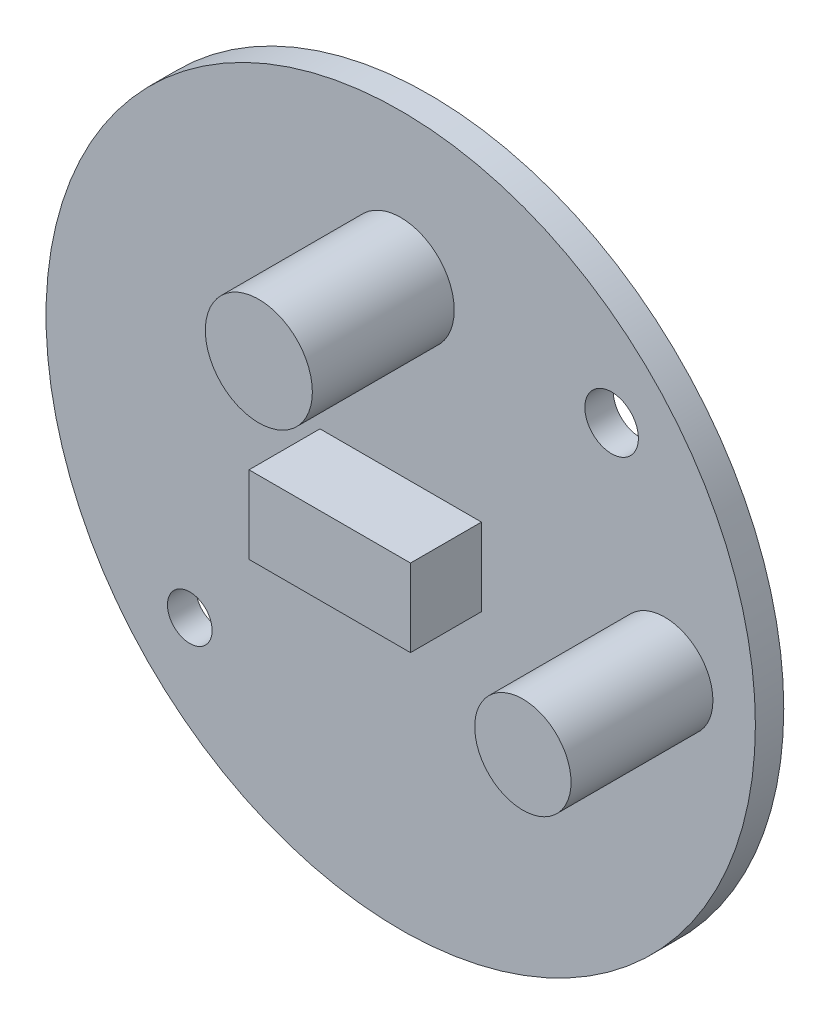
ISO-10303-21;
HEADER;
FILE_DESCRIPTION(('STEP AP214'),'2;1');
FILE_NAME('part.step','',(''),(''),'','','');
FILE_SCHEMA(('AUTOMOTIVE_DESIGN { 1 0 10303 214 1 1 1 1 }'));
ENDSEC;
DATA;
#1=APPLICATION_CONTEXT('core data for automotive mechanical design processes');
#2=APPLICATION_PROTOCOL_DEFINITION('international standard','automotive_design',2000,#1);
#3=PRODUCT_CONTEXT('',#1,'mechanical');
#4=PRODUCT('Part','Part','',(#3));
#5=PRODUCT_RELATED_PRODUCT_CATEGORY('part','',(#4));
#6=PRODUCT_DEFINITION_FORMATION('','',#4);
#7=PRODUCT_DEFINITION_CONTEXT('part definition',#1,'design');
#8=PRODUCT_DEFINITION('design','',#6,#7);
#9=PRODUCT_DEFINITION_SHAPE('','',#8);
#10=(LENGTH_UNIT() NAMED_UNIT(*) SI_UNIT(.MILLI.,.METRE.));
#11=(NAMED_UNIT(*) PLANE_ANGLE_UNIT() SI_UNIT($,.RADIAN.));
#12=(NAMED_UNIT(*) SI_UNIT($,.STERADIAN.) SOLID_ANGLE_UNIT());
#13=UNCERTAINTY_MEASURE_WITH_UNIT(LENGTH_MEASURE(1.E-05),#10,'distance_accuracy_value','');
#14=(GEOMETRIC_REPRESENTATION_CONTEXT(3) GLOBAL_UNCERTAINTY_ASSIGNED_CONTEXT((#13)) GLOBAL_UNIT_ASSIGNED_CONTEXT((#10,
#11,#12)) REPRESENTATION_CONTEXT('',''));
#15=CARTESIAN_POINT('',(0.,0.,0.));
#16=DIRECTION('',(0.,0.,1.));
#17=DIRECTION('',(1.,0.,0.));
#18=AXIS2_PLACEMENT_3D('',#15,#16,#17);
#19=CARTESIAN_POINT('',(0.,0.,2.));
#20=DIRECTION('',(0.,0.,1.));
#21=DIRECTION('',(1.,0.,0.));
#22=AXIS2_PLACEMENT_3D('',#19,#20,#21);
#23=PLANE('',#22);
#24=CARTESIAN_POINT('',(-14.8658829249433,-13.379294632449,2.));
#25=DIRECTION('',(0.,0.,1.));
#26=DIRECTION('',(1.,0.,0.));
#27=AXIS2_PLACEMENT_3D('',#24,#25,#26);
#28=CIRCLE('',#27,1.57488491081214);
#29=CARTESIAN_POINT('',(-13.2909980141312,-13.379294632449,2.));
#30=VERTEX_POINT('',#29);
#31=EDGE_CURVE('E151',#30,#30,#28,.T.);
#32=ORIENTED_EDGE('',*,*,#31,.F.);
#33=EDGE_LOOP('',(#32));
#34=FACE_BOUND('',#33,.T.);
#35=CARTESIAN_POINT('',(14.8658829249433,13.379294632449,2.));
#36=DIRECTION('',(0.,0.,1.));
#37=DIRECTION('',(1.,0.,0.));
#38=AXIS2_PLACEMENT_3D('',#35,#36,#37);
#39=CIRCLE('',#38,1.88796675128296);
#40=CARTESIAN_POINT('',(16.7538496762263,13.379294632449,2.));
#41=VERTEX_POINT('',#40);
#42=EDGE_CURVE('E158',#41,#41,#39,.T.);
#43=ORIENTED_EDGE('',*,*,#42,.F.);
#44=EDGE_LOOP('',(#43));
#45=FACE_BOUND('',#44,.T.);
#46=CARTESIAN_POINT('',(18.6111465208631,0.,2.));
#47=DIRECTION('',(0.,0.,1.));
#48=DIRECTION('',(1.,0.,0.));
#49=AXIS2_PLACEMENT_3D('',#46,#47,#48);
#50=CIRCLE('',#49,3.39523039396583);
#51=CARTESIAN_POINT('',(22.0063769148289,0.,2.));
#52=VERTEX_POINT('',#51);
#53=EDGE_CURVE('E130',#52,#52,#50,.T.);
#54=ORIENTED_EDGE('',*,*,#53,.F.);
#55=EDGE_LOOP('',(#54));
#56=FACE_BOUND('',#55,.T.);
#57=CARTESIAN_POINT('',(0.,14.7126650405187,2.));
#58=DIRECTION('',(0.,0.,1.));
#59=DIRECTION('',(1.,0.,0.));
#60=AXIS2_PLACEMENT_3D('',#57,#58,#59);
#61=CIRCLE('',#60,3.7724782155176);
#62=CARTESIAN_POINT('',(3.7724782155176,14.7126650405187,2.));
#63=VERTEX_POINT('',#62);
#64=EDGE_CURVE('E135',#63,#63,#61,.T.);
#65=ORIENTED_EDGE('',*,*,#64,.F.);
#66=EDGE_LOOP('',(#65));
#67=FACE_BOUND('',#66,.T.);
#68=CARTESIAN_POINT('',(0.,0.,2.));
#69=DIRECTION('',(0.,0.,1.));
#70=DIRECTION('',(1.,0.,0.));
#71=AXIS2_PLACEMENT_3D('',#68,#69,#70);
#72=CIRCLE('',#71,25.);
#73=CARTESIAN_POINT('',(25.,0.,2.));
#74=VERTEX_POINT('',#73);
#75=EDGE_CURVE('E11',#74,#74,#72,.T.);
#76=ORIENTED_EDGE('',*,*,#75,.T.);
#77=EDGE_LOOP('',(#76));
#78=FACE_BOUND('',#77,.T.);
#79=DIRECTION('',(-1.,0.,0.));
#80=VECTOR('',#79,1.);
#81=CARTESIAN_POINT('',(-5.69040863271529,2.73504670625025,2.));
#82=LINE('',#81,#80);
#83=CARTESIAN_POINT('',(5.69040863271529,2.73504670625025,2.));
#84=VERTEX_POINT('',#83);
#85=CARTESIAN_POINT('',(-5.69040863271529,2.73504670625025,2.));
#86=VERTEX_POINT('',#85);
#87=EDGE_CURVE('E99',#84,#86,#82,.T.);
#88=ORIENTED_EDGE('',*,*,#87,.F.);
#89=DIRECTION('',(0.,1.,0.));
#90=VECTOR('',#89,1.);
#91=CARTESIAN_POINT('',(5.69040863271529,2.73504670625025,2.));
#92=LINE('',#91,#90);
#93=CARTESIAN_POINT('',(5.69040863271529,-2.73504670625025,2.));
#94=VERTEX_POINT('',#93);
#95=EDGE_CURVE('E113',#94,#84,#92,.T.);
#96=ORIENTED_EDGE('',*,*,#95,.F.);
#97=DIRECTION('',(1.,0.,0.));
#98=VECTOR('',#97,1.);
#99=CARTESIAN_POINT('',(-5.69040863271529,-2.73504670625025,2.));
#100=LINE('',#99,#98);
#101=CARTESIAN_POINT('',(-5.69040863271529,-2.73504670625025,2.));
#102=VERTEX_POINT('',#101);
#103=EDGE_CURVE('E79',#102,#94,#100,.T.);
#104=ORIENTED_EDGE('',*,*,#103,.F.);
#105=DIRECTION('',(0.,-1.,0.));
#106=VECTOR('',#105,1.);
#107=CARTESIAN_POINT('',(-5.69040863271529,2.73504670625025,2.));
#108=LINE('',#107,#106);
#109=EDGE_CURVE('E119',#86,#102,#108,.T.);
#110=ORIENTED_EDGE('',*,*,#109,.F.);
#111=EDGE_LOOP('',(#88,#96,#104,#110));
#112=FACE_BOUND('',#111,.T.);
#113=ADVANCED_FACE('F39',(#34,#45,#56,#67,#78,#112),#23,.T.);
#114=CARTESIAN_POINT('',(0.,0.,2.));
#115=DIRECTION('',(0.,0.,-1.));
#116=DIRECTION('',(-1.,0.,0.));
#117=AXIS2_PLACEMENT_3D('',#114,#115,#116);
#118=CYLINDRICAL_SURFACE('',#117,25.);
#119=ORIENTED_EDGE('',*,*,#75,.F.);
#120=EDGE_LOOP('',(#119));
#121=FACE_BOUND('',#120,.T.);
#122=CARTESIAN_POINT('',(0.,0.,0.));
#123=DIRECTION('',(0.,0.,1.));
#124=DIRECTION('',(1.,0.,0.));
#125=AXIS2_PLACEMENT_3D('',#122,#123,#124);
#126=CIRCLE('',#125,25.);
#127=CARTESIAN_POINT('',(25.,0.,0.));
#128=VERTEX_POINT('',#127);
#129=EDGE_CURVE('E49',#128,#128,#126,.T.);
#130=ORIENTED_EDGE('',*,*,#129,.T.);
#131=EDGE_LOOP('',(#130));
#132=FACE_BOUND('',#131,.T.);
#133=ADVANCED_FACE('F41',(#121,#132),#118,.T.);
#134=CARTESIAN_POINT('',(0.,0.,0.));
#135=DIRECTION('',(0.,0.,1.));
#136=DIRECTION('',(1.,0.,0.));
#137=AXIS2_PLACEMENT_3D('',#134,#135,#136);
#138=PLANE('',#137);
#139=CARTESIAN_POINT('',(-14.8658829249433,-13.379294632449,0.));
#140=DIRECTION('',(0.,0.,1.));
#141=DIRECTION('',(1.,0.,0.));
#142=AXIS2_PLACEMENT_3D('',#139,#140,#141);
#143=CIRCLE('',#142,1.57488491081214);
#144=CARTESIAN_POINT('',(-13.2909980141312,-13.379294632449,0.));
#145=VERTEX_POINT('',#144);
#146=EDGE_CURVE('E43',#145,#145,#143,.T.);
#147=ORIENTED_EDGE('',*,*,#146,.T.);
#148=EDGE_LOOP('',(#147));
#149=FACE_BOUND('',#148,.T.);
#150=CARTESIAN_POINT('',(14.8658829249433,13.379294632449,0.));
#151=DIRECTION('',(0.,0.,1.));
#152=DIRECTION('',(1.,0.,0.));
#153=AXIS2_PLACEMENT_3D('',#150,#151,#152);
#154=CIRCLE('',#153,1.88796675128296);
#155=CARTESIAN_POINT('',(16.7538496762263,13.379294632449,0.));
#156=VERTEX_POINT('',#155);
#157=EDGE_CURVE('E148',#156,#156,#154,.T.);
#158=ORIENTED_EDGE('',*,*,#157,.T.);
#159=EDGE_LOOP('',(#158));
#160=FACE_BOUND('',#159,.T.);
#161=ORIENTED_EDGE('',*,*,#129,.F.);
#162=EDGE_LOOP('',(#161));
#163=FACE_BOUND('',#162,.T.);
#164=ADVANCED_FACE('F213',(#149,#160,#163),#138,.F.);
#165=CARTESIAN_POINT('',(0.,14.7126650405187,12.));
#166=DIRECTION('',(0.,0.,-1.));
#167=DIRECTION('',(-1.,0.,0.));
#168=AXIS2_PLACEMENT_3D('',#165,#166,#167);
#169=CYLINDRICAL_SURFACE('',#168,3.7724782155176);
#170=CARTESIAN_POINT('',(0.,14.7126650405187,12.));
#171=DIRECTION('',(0.,0.,1.));
#172=DIRECTION('',(1.,0.,0.));
#173=AXIS2_PLACEMENT_3D('',#170,#171,#172);
#174=CIRCLE('',#173,3.7724782155176);
#175=CARTESIAN_POINT('',(3.7724782155176,14.7126650405187,12.));
#176=VERTEX_POINT('',#175);
#177=EDGE_CURVE('E139',#176,#176,#174,.T.);
#178=ORIENTED_EDGE('',*,*,#177,.F.);
#179=EDGE_LOOP('',(#178));
#180=FACE_BOUND('',#179,.T.);
#181=ORIENTED_EDGE('',*,*,#64,.T.);
#182=EDGE_LOOP('',(#181));
#183=FACE_BOUND('',#182,.T.);
#184=ADVANCED_FACE('F210',(#180,#183),#169,.T.);
#185=CARTESIAN_POINT('',(0.,14.7126650405187,12.));
#186=DIRECTION('',(0.,0.,1.));
#187=DIRECTION('',(1.,0.,0.));
#188=AXIS2_PLACEMENT_3D('',#185,#186,#187);
#189=PLANE('',#188);
#190=ORIENTED_EDGE('',*,*,#177,.T.);
#191=EDGE_LOOP('',(#190));
#192=FACE_BOUND('',#191,.T.);
#193=ADVANCED_FACE('F206',(#192),#189,.T.);
#194=CARTESIAN_POINT('',(18.6111465208631,0.,12.));
#195=DIRECTION('',(0.,0.,-1.));
#196=DIRECTION('',(-1.,0.,0.));
#197=AXIS2_PLACEMENT_3D('',#194,#195,#196);
#198=CYLINDRICAL_SURFACE('',#197,3.39523039396583);
#199=CARTESIAN_POINT('',(18.6111465208631,0.,12.));
#200=DIRECTION('',(0.,0.,1.));
#201=DIRECTION('',(1.,0.,0.));
#202=AXIS2_PLACEMENT_3D('',#199,#200,#201);
#203=CIRCLE('',#202,3.39523039396583);
#204=CARTESIAN_POINT('',(22.0063769148289,0.,12.));
#205=VERTEX_POINT('',#204);
#206=EDGE_CURVE('E131',#205,#205,#203,.T.);
#207=ORIENTED_EDGE('',*,*,#206,.F.);
#208=EDGE_LOOP('',(#207));
#209=FACE_BOUND('',#208,.T.);
#210=ORIENTED_EDGE('',*,*,#53,.T.);
#211=EDGE_LOOP('',(#210));
#212=FACE_BOUND('',#211,.T.);
#213=ADVANCED_FACE('F202',(#209,#212),#198,.T.);
#214=CARTESIAN_POINT('',(18.6111465208631,0.,12.));
#215=DIRECTION('',(0.,0.,1.));
#216=DIRECTION('',(1.,0.,0.));
#217=AXIS2_PLACEMENT_3D('',#214,#215,#216);
#218=PLANE('',#217);
#219=ORIENTED_EDGE('',*,*,#206,.T.);
#220=EDGE_LOOP('',(#219));
#221=FACE_BOUND('',#220,.T.);
#222=ADVANCED_FACE('F199',(#221),#218,.T.);
#223=CARTESIAN_POINT('',(5.69040863271529,2.73504670625025,7.));
#224=DIRECTION('',(-1.,0.,0.));
#225=DIRECTION('',(0.,0.,1.));
#226=AXIS2_PLACEMENT_3D('',#223,#224,#225);
#227=PLANE('',#226);
#228=ORIENTED_EDGE('',*,*,#95,.T.);
#229=DIRECTION('',(0.,0.,-1.));
#230=VECTOR('',#229,1.);
#231=CARTESIAN_POINT('',(5.69040863271529,2.73504670625025,7.));
#232=LINE('',#231,#230);
#233=CARTESIAN_POINT('',(5.69040863271529,2.73504670625025,7.));
#234=VERTEX_POINT('',#233);
#235=EDGE_CURVE('E103',#234,#84,#232,.T.);
#236=ORIENTED_EDGE('',*,*,#235,.F.);
#237=DIRECTION('',(0.,1.,0.));
#238=VECTOR('',#237,1.);
#239=CARTESIAN_POINT('',(5.69040863271529,2.73504670625025,7.));
#240=LINE('',#239,#238);
#241=CARTESIAN_POINT('',(5.69040863271529,-2.73504670625025,7.));
#242=VERTEX_POINT('',#241);
#243=EDGE_CURVE('E91',#242,#234,#240,.T.);
#244=ORIENTED_EDGE('',*,*,#243,.F.);
#245=DIRECTION('',(0.,0.,-1.));
#246=VECTOR('',#245,1.);
#247=CARTESIAN_POINT('',(5.69040863271529,-2.73504670625025,7.));
#248=LINE('',#247,#246);
#249=EDGE_CURVE('E109',#242,#94,#248,.T.);
#250=ORIENTED_EDGE('',*,*,#249,.T.);
#251=EDGE_LOOP('',(#228,#236,#244,#250));
#252=FACE_BOUND('',#251,.T.);
#253=ADVANCED_FACE('F183',(#252),#227,.F.);
#254=CARTESIAN_POINT('',(-5.69040863271529,2.73504670625025,7.));
#255=DIRECTION('',(0.,-1.,0.));
#256=DIRECTION('',(0.,0.,-1.));
#257=AXIS2_PLACEMENT_3D('',#254,#255,#256);
#258=PLANE('',#257);
#259=ORIENTED_EDGE('',*,*,#87,.T.);
#260=DIRECTION('',(0.,0.,-1.));
#261=VECTOR('',#260,1.);
#262=CARTESIAN_POINT('',(-5.69040863271529,2.73504670625025,7.));
#263=LINE('',#262,#261);
#264=CARTESIAN_POINT('',(-5.69040863271529,2.73504670625025,7.));
#265=VERTEX_POINT('',#264);
#266=EDGE_CURVE('E96',#265,#86,#263,.T.);
#267=ORIENTED_EDGE('',*,*,#266,.F.);
#268=DIRECTION('',(-1.,0.,0.));
#269=VECTOR('',#268,1.);
#270=CARTESIAN_POINT('',(-5.69040863271529,2.73504670625025,7.));
#271=LINE('',#270,#269);
#272=EDGE_CURVE('E86',#234,#265,#271,.T.);
#273=ORIENTED_EDGE('',*,*,#272,.F.);
#274=ORIENTED_EDGE('',*,*,#235,.T.);
#275=EDGE_LOOP('',(#259,#267,#273,#274));
#276=FACE_BOUND('',#275,.T.);
#277=ADVANCED_FACE('F97',(#276),#258,.F.);
#278=CARTESIAN_POINT('',(-5.69040863271529,2.73504670625025,7.));
#279=DIRECTION('',(1.,0.,0.));
#280=DIRECTION('',(0.,0.,-1.));
#281=AXIS2_PLACEMENT_3D('',#278,#279,#280);
#282=PLANE('',#281);
#283=ORIENTED_EDGE('',*,*,#109,.T.);
#284=DIRECTION('',(0.,0.,-1.));
#285=VECTOR('',#284,1.);
#286=CARTESIAN_POINT('',(-5.69040863271529,-2.73504670625025,7.));
#287=LINE('',#286,#285);
#288=CARTESIAN_POINT('',(-5.69040863271529,-2.73504670625025,7.));
#289=VERTEX_POINT('',#288);
#290=EDGE_CURVE('E57',#289,#102,#287,.T.);
#291=ORIENTED_EDGE('',*,*,#290,.F.);
#292=DIRECTION('',(0.,-1.,0.));
#293=VECTOR('',#292,1.);
#294=CARTESIAN_POINT('',(-5.69040863271529,2.73504670625025,7.));
#295=LINE('',#294,#293);
#296=EDGE_CURVE('E89',#265,#289,#295,.T.);
#297=ORIENTED_EDGE('',*,*,#296,.F.);
#298=ORIENTED_EDGE('',*,*,#266,.T.);
#299=EDGE_LOOP('',(#283,#291,#297,#298));
#300=FACE_BOUND('',#299,.T.);
#301=ADVANCED_FACE('F105',(#300),#282,.F.);
#302=CARTESIAN_POINT('',(-5.69040863271529,-2.73504670625025,7.));
#303=DIRECTION('',(0.,1.,0.));
#304=DIRECTION('',(0.,0.,1.));
#305=AXIS2_PLACEMENT_3D('',#302,#303,#304);
#306=PLANE('',#305);
#307=ORIENTED_EDGE('',*,*,#103,.T.);
#308=ORIENTED_EDGE('',*,*,#249,.F.);
#309=DIRECTION('',(1.,0.,0.));
#310=VECTOR('',#309,1.);
#311=CARTESIAN_POINT('',(-5.69040863271529,-2.73504670625025,7.));
#312=LINE('',#311,#310);
#313=EDGE_CURVE('E65',#289,#242,#312,.T.);
#314=ORIENTED_EDGE('',*,*,#313,.F.);
#315=ORIENTED_EDGE('',*,*,#290,.T.);
#316=EDGE_LOOP('',(#307,#308,#314,#315));
#317=FACE_BOUND('',#316,.T.);
#318=ADVANCED_FACE('F184',(#317),#306,.F.);
#319=CARTESIAN_POINT('',(0.,0.,7.));
#320=DIRECTION('',(0.,0.,1.));
#321=DIRECTION('',(1.,0.,0.));
#322=AXIS2_PLACEMENT_3D('',#319,#320,#321);
#323=PLANE('',#322);
#324=ORIENTED_EDGE('',*,*,#243,.T.);
#325=ORIENTED_EDGE('',*,*,#272,.T.);
#326=ORIENTED_EDGE('',*,*,#296,.T.);
#327=ORIENTED_EDGE('',*,*,#313,.T.);
#328=EDGE_LOOP('',(#324,#325,#326,#327));
#329=FACE_BOUND('',#328,.T.);
#330=ADVANCED_FACE('F87',(#329),#323,.T.);
#331=CARTESIAN_POINT('',(14.8658829249433,13.379294632449,-3.));
#332=DIRECTION('',(0.,0.,1.));
#333=DIRECTION('',(1.,0.,0.));
#334=AXIS2_PLACEMENT_3D('',#331,#332,#333);
#335=CYLINDRICAL_SURFACE('',#334,1.88796675128296);
#336=ORIENTED_EDGE('',*,*,#42,.T.);
#337=EDGE_LOOP('',(#336));
#338=FACE_BOUND('',#337,.T.);
#339=ORIENTED_EDGE('',*,*,#157,.F.);
#340=EDGE_LOOP('',(#339));
#341=FACE_BOUND('',#340,.T.);
#342=ADVANCED_FACE('F168',(#338,#341),#335,.F.);
#343=CARTESIAN_POINT('',(-14.8658829249433,-13.379294632449,-3.));
#344=DIRECTION('',(0.,0.,1.));
#345=DIRECTION('',(1.,0.,0.));
#346=AXIS2_PLACEMENT_3D('',#343,#344,#345);
#347=CYLINDRICAL_SURFACE('',#346,1.57488491081214);
#348=ORIENTED_EDGE('',*,*,#31,.T.);
#349=EDGE_LOOP('',(#348));
#350=FACE_BOUND('',#349,.T.);
#351=ORIENTED_EDGE('',*,*,#146,.F.);
#352=EDGE_LOOP('',(#351));
#353=FACE_BOUND('',#352,.T.);
#354=ADVANCED_FACE('F226',(#350,#353),#347,.F.);
#355=CLOSED_SHELL('',(#113,#133,#164,#184,#193,#213,#222,#253,#277,#301,#318,#330,#342,#354));
#356=MANIFOLD_SOLID_BREP('B2',#355);
#357=ADVANCED_BREP_SHAPE_REPRESENTATION('',(#18,#356),#14);
#358=SHAPE_DEFINITION_REPRESENTATION(#9,#357);
ENDSEC;
END-ISO-10303-21;
